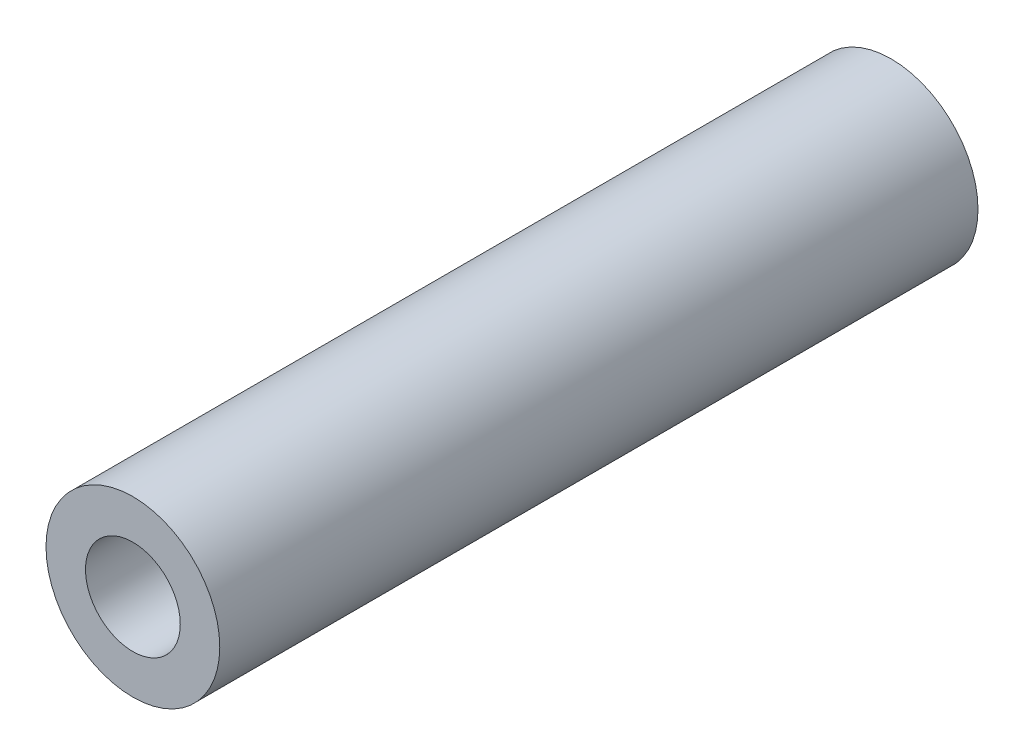
ISO-10303-21;
HEADER;
FILE_DESCRIPTION(('STEP AP214'),'2;1');
FILE_NAME('part.step','',(''),(''),'','','');
FILE_SCHEMA(('AUTOMOTIVE_DESIGN { 1 0 10303 214 1 1 1 1 }'));
ENDSEC;
DATA;
#1=APPLICATION_CONTEXT('core data for automotive mechanical design processes');
#2=APPLICATION_PROTOCOL_DEFINITION('international standard','automotive_design',2000,#1);
#3=PRODUCT_CONTEXT('',#1,'mechanical');
#4=PRODUCT('Part','Part','',(#3));
#5=PRODUCT_RELATED_PRODUCT_CATEGORY('part','',(#4));
#6=PRODUCT_DEFINITION_FORMATION('','',#4);
#7=PRODUCT_DEFINITION_CONTEXT('part definition',#1,'design');
#8=PRODUCT_DEFINITION('design','',#6,#7);
#9=PRODUCT_DEFINITION_SHAPE('','',#8);
#10=(LENGTH_UNIT() NAMED_UNIT(*) SI_UNIT(.MILLI.,.METRE.));
#11=(NAMED_UNIT(*) PLANE_ANGLE_UNIT() SI_UNIT($,.RADIAN.));
#12=(NAMED_UNIT(*) SI_UNIT($,.STERADIAN.) SOLID_ANGLE_UNIT());
#13=UNCERTAINTY_MEASURE_WITH_UNIT(LENGTH_MEASURE(1.E-05),#10,'distance_accuracy_value','');
#14=(GEOMETRIC_REPRESENTATION_CONTEXT(3) GLOBAL_UNCERTAINTY_ASSIGNED_CONTEXT((#13)) GLOBAL_UNIT_ASSIGNED_CONTEXT((#10,
#11,#12)) REPRESENTATION_CONTEXT('',''));
#15=CARTESIAN_POINT('',(0.,0.,0.));
#16=DIRECTION('',(0.,0.,1.));
#17=DIRECTION('',(1.,0.,0.));
#18=AXIS2_PLACEMENT_3D('',#15,#16,#17);
#19=CARTESIAN_POINT('',(0.,0.,0.));
#20=DIRECTION('',(0.,0.,1.));
#21=DIRECTION('',(1.,0.,0.));
#22=AXIS2_PLACEMENT_3D('',#19,#20,#21);
#23=PLANE('',#22);
#24=CARTESIAN_POINT('',(0.,0.,0.));
#25=DIRECTION('',(0.,0.,1.));
#26=DIRECTION('',(1.,0.,0.));
#27=AXIS2_PLACEMENT_3D('',#24,#25,#26);
#28=CIRCLE('',#27,4.7625);
#29=CARTESIAN_POINT('',(4.7625,0.,0.));
#30=VERTEX_POINT('',#29);
#31=EDGE_CURVE('E66',#30,#30,#28,.F.);
#32=ORIENTED_EDGE('',*,*,#31,.F.);
#33=EDGE_LOOP('',(#32));
#34=FACE_BOUND('',#33,.T.);
#35=CARTESIAN_POINT('',(0.,0.,0.));
#36=DIRECTION('',(0.,0.,1.));
#37=DIRECTION('',(1.,0.,0.));
#38=AXIS2_PLACEMENT_3D('',#35,#36,#37);
#39=CIRCLE('',#38,8.73125);
#40=CARTESIAN_POINT('',(8.73125,0.,0.));
#41=VERTEX_POINT('',#40);
#42=EDGE_CURVE('E56',#41,#41,#39,.T.);
#43=ORIENTED_EDGE('',*,*,#42,.F.);
#44=EDGE_LOOP('',(#43));
#45=FACE_BOUND('',#44,.T.);
#46=ADVANCED_FACE('F49',(#34,#45),#23,.F.);
#47=CARTESIAN_POINT('',(0.,0.,76.2));
#48=DIRECTION('',(0.,0.,1.));
#49=DIRECTION('',(1.,0.,0.));
#50=AXIS2_PLACEMENT_3D('',#47,#48,#49);
#51=PLANE('',#50);
#52=CARTESIAN_POINT('',(0.,0.,76.2));
#53=DIRECTION('',(0.,0.,1.));
#54=DIRECTION('',(1.,0.,0.));
#55=AXIS2_PLACEMENT_3D('',#52,#53,#54);
#56=CIRCLE('',#55,4.7625);
#57=CARTESIAN_POINT('',(4.7625,0.,76.2));
#58=VERTEX_POINT('',#57);
#59=EDGE_CURVE('E61',#58,#58,#56,.F.);
#60=ORIENTED_EDGE('',*,*,#59,.T.);
#61=EDGE_LOOP('',(#60));
#62=FACE_BOUND('',#61,.T.);
#63=CARTESIAN_POINT('',(0.,0.,76.2));
#64=DIRECTION('',(0.,0.,1.));
#65=DIRECTION('',(1.,0.,0.));
#66=AXIS2_PLACEMENT_3D('',#63,#64,#65);
#67=CIRCLE('',#66,8.73125);
#68=CARTESIAN_POINT('',(8.73125,0.,76.2));
#69=VERTEX_POINT('',#68);
#70=EDGE_CURVE('E11',#69,#69,#67,.T.);
#71=ORIENTED_EDGE('',*,*,#70,.T.);
#72=EDGE_LOOP('',(#71));
#73=FACE_BOUND('',#72,.T.);
#74=ADVANCED_FACE('F78',(#62,#73),#51,.T.);
#75=CARTESIAN_POINT('',(0.,0.,0.));
#76=DIRECTION('',(0.,0.,1.));
#77=DIRECTION('',(1.,0.,0.));
#78=AXIS2_PLACEMENT_3D('',#75,#76,#77);
#79=CYLINDRICAL_SURFACE('',#78,8.73125);
#80=ORIENTED_EDGE('',*,*,#70,.F.);
#81=EDGE_LOOP('',(#80));
#82=FACE_BOUND('',#81,.T.);
#83=ORIENTED_EDGE('',*,*,#42,.T.);
#84=EDGE_LOOP('',(#83));
#85=FACE_BOUND('',#84,.T.);
#86=ADVANCED_FACE('F82',(#82,#85),#79,.T.);
#87=CARTESIAN_POINT('',(0.,0.,-0.999999999999999));
#88=DIRECTION('',(0.,0.,1.));
#89=DIRECTION('',(1.,0.,0.));
#90=AXIS2_PLACEMENT_3D('',#87,#88,#89);
#91=CYLINDRICAL_SURFACE('',#90,4.7625);
#92=ORIENTED_EDGE('',*,*,#31,.T.);
#93=EDGE_LOOP('',(#92));
#94=FACE_BOUND('',#93,.T.);
#95=ORIENTED_EDGE('',*,*,#59,.F.);
#96=EDGE_LOOP('',(#95));
#97=FACE_BOUND('',#96,.T.);
#98=ADVANCED_FACE('F73',(#94,#97),#91,.F.);
#99=CLOSED_SHELL('',(#46,#74,#86,#98));
#100=MANIFOLD_SOLID_BREP('B2',#99);
#101=ADVANCED_BREP_SHAPE_REPRESENTATION('',(#18,#100),#14);
#102=SHAPE_DEFINITION_REPRESENTATION(#9,#101);
ENDSEC;
END-ISO-10303-21;
